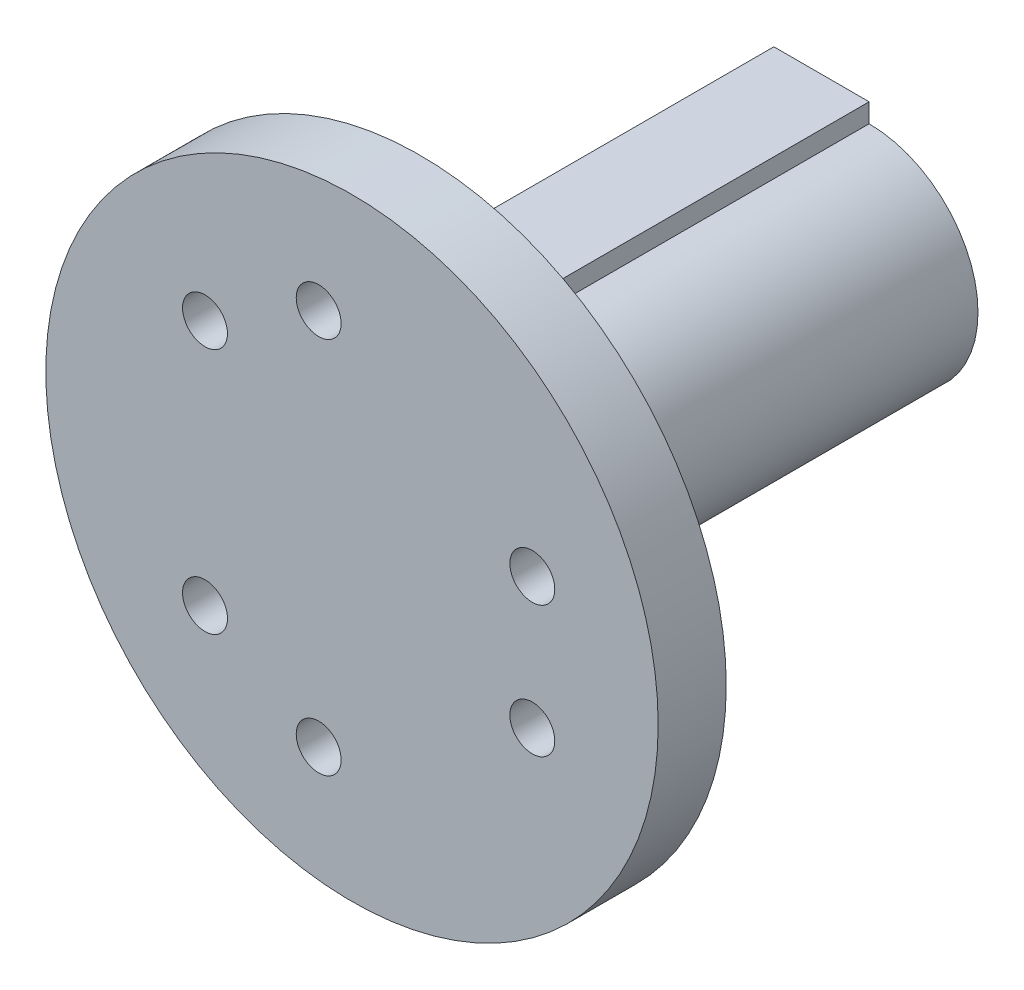
ISO-10303-21;
HEADER;
FILE_DESCRIPTION(('STEP AP214'),'2;1');
FILE_NAME('part.step','',(''),(''),'','','');
FILE_SCHEMA(('AUTOMOTIVE_DESIGN { 1 0 10303 214 1 1 1 1 }'));
ENDSEC;
DATA;
#1=APPLICATION_CONTEXT('core data for automotive mechanical design processes');
#2=APPLICATION_PROTOCOL_DEFINITION('international standard','automotive_design',2000,#1);
#3=PRODUCT_CONTEXT('',#1,'mechanical');
#4=PRODUCT('Part','Part','',(#3));
#5=PRODUCT_RELATED_PRODUCT_CATEGORY('part','',(#4));
#6=PRODUCT_DEFINITION_FORMATION('','',#4);
#7=PRODUCT_DEFINITION_CONTEXT('part definition',#1,'design');
#8=PRODUCT_DEFINITION('design','',#6,#7);
#9=PRODUCT_DEFINITION_SHAPE('','',#8);
#10=(LENGTH_UNIT() NAMED_UNIT(*) SI_UNIT(.MILLI.,.METRE.));
#11=(NAMED_UNIT(*) PLANE_ANGLE_UNIT() SI_UNIT($,.RADIAN.));
#12=(NAMED_UNIT(*) SI_UNIT($,.STERADIAN.) SOLID_ANGLE_UNIT());
#13=UNCERTAINTY_MEASURE_WITH_UNIT(LENGTH_MEASURE(1.E-05),#10,'distance_accuracy_value','');
#14=(GEOMETRIC_REPRESENTATION_CONTEXT(3) GLOBAL_UNCERTAINTY_ASSIGNED_CONTEXT((#13)) GLOBAL_UNIT_ASSIGNED_CONTEXT((#10,
#11,#12)) REPRESENTATION_CONTEXT('',''));
#15=CARTESIAN_POINT('',(0.,0.,0.));
#16=DIRECTION('',(0.,0.,1.));
#17=DIRECTION('',(1.,0.,0.));
#18=AXIS2_PLACEMENT_3D('',#15,#16,#17);
#19=CARTESIAN_POINT('',(0.,25.,-10.));
#20=DIRECTION('',(0.,0.,-1.));
#21=DIRECTION('',(-1.,0.,0.));
#22=AXIS2_PLACEMENT_3D('',#19,#20,#21);
#23=PLANE('',#22);
#24=CARTESIAN_POINT('',(0.,0.,-10.));
#25=DIRECTION('',(0.,0.,-1.));
#26=DIRECTION('',(-1.,0.,0.));
#27=AXIS2_PLACEMENT_3D('',#24,#25,#26);
#28=CIRCLE('',#27,8.);
#29=CARTESIAN_POINT('',(-7.,-3.87298334620742,-10.));
#30=VERTEX_POINT('',#29);
#31=CARTESIAN_POINT('',(-7.97746827007165,-0.600000000000003,-10.));
#32=VERTEX_POINT('',#31);
#33=EDGE_CURVE('E41',#30,#32,#28,.T.);
#34=ORIENTED_EDGE('',*,*,#33,.T.);
#35=DIRECTION('',(1.,0.,0.));
#36=VECTOR('',#35,1.);
#37=CARTESIAN_POINT('',(-8.,-0.600000000000003,-10.));
#38=LINE('',#37,#36);
#39=CARTESIAN_POINT('',(-7.,-0.600000000000003,-10.));
#40=VERTEX_POINT('',#39);
#41=EDGE_CURVE('E150',#32,#40,#38,.T.);
#42=ORIENTED_EDGE('',*,*,#41,.T.);
#43=DIRECTION('',(0.,1.,0.));
#44=VECTOR('',#43,1.);
#45=CARTESIAN_POINT('',(-7.,-9.4,-10.));
#46=LINE('',#45,#44);
#47=EDGE_CURVE('E186',#30,#40,#46,.T.);
#48=ORIENTED_EDGE('',*,*,#47,.F.);
#49=EDGE_LOOP('',(#34,#42,#48));
#50=FACE_BOUND('',#49,.T.);
#51=ADVANCED_FACE('F33',(#50),#23,.T.);
#52=CARTESIAN_POINT('',(-7.,0.599999999999997,-10.));
#53=VERTEX_POINT('',#52);
#54=CARTESIAN_POINT('',(-7.,3.87298334620742,-10.));
#55=VERTEX_POINT('',#54);
#56=EDGE_CURVE('E187',#53,#55,#46,.T.);
#57=ORIENTED_EDGE('',*,*,#56,.F.);
#58=DIRECTION('',(1.,0.,0.));
#59=VECTOR('',#58,1.);
#60=CARTESIAN_POINT('',(-8.,0.599999999999997,-10.));
#61=LINE('',#60,#59);
#62=CARTESIAN_POINT('',(-7.97746827007165,0.599999999999997,-10.));
#63=VERTEX_POINT('',#62);
#64=EDGE_CURVE('E305',#63,#53,#61,.T.);
#65=ORIENTED_EDGE('',*,*,#64,.F.);
#66=EDGE_CURVE('E42',#63,#55,#28,.T.);
#67=ORIENTED_EDGE('',*,*,#66,.T.);
#68=EDGE_LOOP('',(#57,#65,#67));
#69=FACE_BOUND('',#68,.T.);
#70=ADVANCED_FACE('F307',(#69),#23,.T.);
#71=CARTESIAN_POINT('',(-7.,0.,0.));
#72=DIRECTION('',(1.,0.,0.));
#73=DIRECTION('',(0.,0.,-1.));
#74=AXIS2_PLACEMENT_3D('',#71,#72,#73);
#75=PLANE('',#74);
#76=DIRECTION('',(0.,0.,1.));
#77=VECTOR('',#76,1.);
#78=CARTESIAN_POINT('',(-7.,-0.600000000000003,-33.));
#79=LINE('',#78,#77);
#80=CARTESIAN_POINT('',(-7.,-0.600000000000003,-33.));
#81=VERTEX_POINT('',#80);
#82=EDGE_CURVE('E312',#81,#40,#79,.T.);
#83=ORIENTED_EDGE('',*,*,#82,.F.);
#84=DIRECTION('',(0.,1.,0.));
#85=VECTOR('',#84,1.);
#86=CARTESIAN_POINT('',(-7.,-9.4,-33.));
#87=LINE('',#86,#85);
#88=CARTESIAN_POINT('',(-7.,-9.4,-33.));
#89=VERTEX_POINT('',#88);
#90=EDGE_CURVE('E165',#89,#81,#87,.T.);
#91=ORIENTED_EDGE('',*,*,#90,.F.);
#92=DIRECTION('',(0.,0.,1.));
#93=VECTOR('',#92,1.);
#94=CARTESIAN_POINT('',(-7.,-9.4,-25.));
#95=LINE('',#94,#93);
#96=CARTESIAN_POINT('',(-7.,-9.4,-10.));
#97=VERTEX_POINT('',#96);
#98=EDGE_CURVE('E178',#89,#97,#95,.T.);
#99=ORIENTED_EDGE('',*,*,#98,.T.);
#100=EDGE_CURVE('E182',#97,#30,#46,.T.);
#101=ORIENTED_EDGE('',*,*,#100,.T.);
#102=ORIENTED_EDGE('',*,*,#47,.T.);
#103=EDGE_LOOP('',(#83,#91,#99,#101,#102));
#104=FACE_BOUND('',#103,.T.);
#105=ADVANCED_FACE('F320',(#104),#75,.F.);
#106=DIRECTION('',(0.,0.,-1.));
#107=VECTOR('',#106,1.);
#108=CARTESIAN_POINT('',(-7.,0.599999999999997,-33.));
#109=LINE('',#108,#107);
#110=CARTESIAN_POINT('',(-7.,0.599999999999996,-33.));
#111=VERTEX_POINT('',#110);
#112=EDGE_CURVE('E146',#53,#111,#109,.T.);
#113=ORIENTED_EDGE('',*,*,#112,.F.);
#114=ORIENTED_EDGE('',*,*,#56,.T.);
#115=CARTESIAN_POINT('',(-7.,9.4,-10.));
#116=VERTEX_POINT('',#115);
#117=EDGE_CURVE('E180',#55,#116,#46,.T.);
#118=ORIENTED_EDGE('',*,*,#117,.T.);
#119=DIRECTION('',(0.,0.,-1.));
#120=VECTOR('',#119,1.);
#121=CARTESIAN_POINT('',(-7.,9.4,-25.));
#122=LINE('',#121,#120);
#123=CARTESIAN_POINT('',(-7.,9.4,-33.));
#124=VERTEX_POINT('',#123);
#125=EDGE_CURVE('E185',#116,#124,#122,.T.);
#126=ORIENTED_EDGE('',*,*,#125,.T.);
#127=EDGE_CURVE('E164',#111,#124,#87,.T.);
#128=ORIENTED_EDGE('',*,*,#127,.F.);
#129=EDGE_LOOP('',(#113,#114,#118,#126,#128));
#130=FACE_BOUND('',#129,.T.);
#131=ADVANCED_FACE('F325',(#130),#75,.F.);
#132=CARTESIAN_POINT('',(0.,0.,-25.));
#133=DIRECTION('',(0.,0.,1.));
#134=DIRECTION('',(1.,0.,0.));
#135=AXIS2_PLACEMENT_3D('',#132,#133,#134);
#136=CYLINDRICAL_SURFACE('',#135,8.);
#137=CARTESIAN_POINT('',(0.,0.,0.));
#138=DIRECTION('',(0.,0.,1.));
#139=DIRECTION('',(1.,0.,0.));
#140=AXIS2_PLACEMENT_3D('',#137,#138,#139);
#141=CIRCLE('',#140,8.);
#142=CARTESIAN_POINT('',(8.,0.,0.));
#143=VERTEX_POINT('',#142);
#144=EDGE_CURVE('E269',#143,#143,#141,.F.);
#145=ORIENTED_EDGE('',*,*,#144,.T.);
#146=EDGE_LOOP('',(#145));
#147=FACE_BOUND('',#146,.T.);
#148=DIRECTION('',(0.,0.,1.));
#149=VECTOR('',#148,1.);
#150=CARTESIAN_POINT('',(0.,-8.,-25.));
#151=LINE('',#150,#149);
#152=CARTESIAN_POINT('',(0.,-8.,-33.));
#153=VERTEX_POINT('',#152);
#154=CARTESIAN_POINT('',(0.,-8.,-10.));
#155=VERTEX_POINT('',#154);
#156=EDGE_CURVE('E206',#153,#155,#151,.T.);
#157=ORIENTED_EDGE('',*,*,#156,.F.);
#158=CARTESIAN_POINT('',(0.,0.,-33.));
#159=DIRECTION('',(0.,0.,-1.));
#160=DIRECTION('',(-1.,0.,0.));
#161=AXIS2_PLACEMENT_3D('',#158,#159,#160);
#162=CIRCLE('',#161,8.);
#163=CARTESIAN_POINT('',(0.,8.,-33.));
#164=VERTEX_POINT('',#163);
#165=EDGE_CURVE('E174',#164,#153,#162,.T.);
#166=ORIENTED_EDGE('',*,*,#165,.F.);
#167=DIRECTION('',(0.,0.,1.));
#168=VECTOR('',#167,1.);
#169=CARTESIAN_POINT('',(0.,8.,-25.));
#170=LINE('',#169,#168);
#171=CARTESIAN_POINT('',(0.,8.,-10.));
#172=VERTEX_POINT('',#171);
#173=EDGE_CURVE('E204',#172,#164,#170,.F.);
#174=ORIENTED_EDGE('',*,*,#173,.F.);
#175=CARTESIAN_POINT('',(0.,0.,-10.));
#176=DIRECTION('',(0.,0.,-1.));
#177=DIRECTION('',(-1.,0.,0.));
#178=AXIS2_PLACEMENT_3D('',#175,#176,#177);
#179=CIRCLE('',#178,8.);
#180=EDGE_CURVE('E202',#55,#172,#179,.T.);
#181=ORIENTED_EDGE('',*,*,#180,.F.);
#182=ORIENTED_EDGE('',*,*,#66,.F.);
#183=CARTESIAN_POINT('',(0.,0.,-10.));
#184=DIRECTION('',(0.,0.,-1.));
#185=DIRECTION('',(-1.,0.,0.));
#186=AXIS2_PLACEMENT_3D('',#183,#184,#185);
#187=CIRCLE('',#186,8.);
#188=CARTESIAN_POINT('',(-8.,0.,-10.));
#189=VERTEX_POINT('',#188);
#190=EDGE_CURVE('E152',#189,#63,#187,.T.);
#191=ORIENTED_EDGE('',*,*,#190,.F.);
#192=EDGE_CURVE('E133',#32,#189,#187,.T.);
#193=ORIENTED_EDGE('',*,*,#192,.F.);
#194=ORIENTED_EDGE('',*,*,#33,.F.);
#195=EDGE_CURVE('E11',#155,#30,#28,.T.);
#196=ORIENTED_EDGE('',*,*,#195,.F.);
#197=EDGE_LOOP('',(#157,#166,#174,#181,#182,#191,#193,#194,#196));
#198=FACE_BOUND('',#197,.T.);
#199=ADVANCED_FACE('F296',(#147,#198),#136,.T.);
#200=CARTESIAN_POINT('',(-10.8012266479776,9.06330529658017,5.));
#201=DIRECTION('',(0.,0.,-1.));
#202=DIRECTION('',(-1.,0.,0.));
#203=AXIS2_PLACEMENT_3D('',#200,#201,#202);
#204=CYLINDRICAL_SURFACE('',#203,1.65);
#205=CARTESIAN_POINT('',(-10.8012266479776,9.06330529658017,5.));
#206=DIRECTION('',(0.,0.,1.));
#207=DIRECTION('',(1.,0.,0.));
#208=AXIS2_PLACEMENT_3D('',#205,#206,#207);
#209=CIRCLE('',#208,1.65);
#210=CARTESIAN_POINT('',(-9.15122664797762,9.06330529658017,5.));
#211=VERTEX_POINT('',#210);
#212=EDGE_CURVE('E259',#211,#211,#209,.T.);
#213=ORIENTED_EDGE('',*,*,#212,.T.);
#214=EDGE_LOOP('',(#213));
#215=FACE_BOUND('',#214,.T.);
#216=CARTESIAN_POINT('',(-10.8012266479776,9.06330529658017,2.));
#217=DIRECTION('',(0.,0.,-1.));
#218=DIRECTION('',(-1.,0.,0.));
#219=AXIS2_PLACEMENT_3D('',#216,#217,#218);
#220=CIRCLE('',#219,1.65);
#221=CARTESIAN_POINT('',(-12.4512266479776,9.06330529658017,2.));
#222=VERTEX_POINT('',#221);
#223=EDGE_CURVE('E246',#222,#222,#220,.T.);
#224=ORIENTED_EDGE('',*,*,#223,.T.);
#225=EDGE_LOOP('',(#224));
#226=FACE_BOUND('',#225,.T.);
#227=ADVANCED_FACE('F365',(#215,#226),#204,.F.);
#228=CARTESIAN_POINT('',(13.2496659530816,-4.82248402089022,5.));
#229=DIRECTION('',(0.,0.,-1.));
#230=DIRECTION('',(-1.,0.,0.));
#231=AXIS2_PLACEMENT_3D('',#228,#229,#230);
#232=CYLINDRICAL_SURFACE('',#231,1.65);
#233=CARTESIAN_POINT('',(13.2496659530816,-4.82248402089022,5.));
#234=DIRECTION('',(0.,0.,1.));
#235=DIRECTION('',(1.,0.,0.));
#236=AXIS2_PLACEMENT_3D('',#233,#234,#235);
#237=CIRCLE('',#236,1.65);
#238=CARTESIAN_POINT('',(14.8996659530816,-4.82248402089022,5.));
#239=VERTEX_POINT('',#238);
#240=EDGE_CURVE('E256',#239,#239,#237,.T.);
#241=ORIENTED_EDGE('',*,*,#240,.T.);
#242=EDGE_LOOP('',(#241));
#243=FACE_BOUND('',#242,.T.);
#244=CARTESIAN_POINT('',(13.2496659530816,-4.82248402089022,2.));
#245=DIRECTION('',(0.,0.,-1.));
#246=DIRECTION('',(-1.,0.,0.));
#247=AXIS2_PLACEMENT_3D('',#244,#245,#246);
#248=CIRCLE('',#247,1.65);
#249=CARTESIAN_POINT('',(11.5996659530816,-4.82248402089022,2.));
#250=VERTEX_POINT('',#249);
#251=EDGE_CURVE('E282',#250,#250,#248,.T.);
#252=ORIENTED_EDGE('',*,*,#251,.T.);
#253=EDGE_LOOP('',(#252));
#254=FACE_BOUND('',#253,.T.);
#255=ADVANCED_FACE('F426',(#243,#254),#232,.F.);
#256=CARTESIAN_POINT('',(13.2496659530816,4.82248402089367,5.));
#257=DIRECTION('',(0.,0.,-1.));
#258=DIRECTION('',(-1.,0.,0.));
#259=AXIS2_PLACEMENT_3D('',#256,#257,#258);
#260=CYLINDRICAL_SURFACE('',#259,1.65);
#261=CARTESIAN_POINT('',(13.2496659530816,4.82248402089367,5.));
#262=DIRECTION('',(0.,0.,1.));
#263=DIRECTION('',(1.,0.,0.));
#264=AXIS2_PLACEMENT_3D('',#261,#262,#263);
#265=CIRCLE('',#264,1.65);
#266=CARTESIAN_POINT('',(14.8996659530816,4.82248402089367,5.));
#267=VERTEX_POINT('',#266);
#268=EDGE_CURVE('E253',#267,#267,#265,.T.);
#269=ORIENTED_EDGE('',*,*,#268,.T.);
#270=EDGE_LOOP('',(#269));
#271=FACE_BOUND('',#270,.T.);
#272=CARTESIAN_POINT('',(13.2496659530816,4.82248402089367,2.));
#273=DIRECTION('',(0.,0.,-1.));
#274=DIRECTION('',(-1.,0.,0.));
#275=AXIS2_PLACEMENT_3D('',#272,#273,#274);
#276=CIRCLE('',#275,1.65);
#277=CARTESIAN_POINT('',(11.5996659530816,4.82248402089367,2.));
#278=VERTEX_POINT('',#277);
#279=EDGE_CURVE('E279',#278,#278,#276,.T.);
#280=ORIENTED_EDGE('',*,*,#279,.T.);
#281=EDGE_LOOP('',(#280));
#282=FACE_BOUND('',#281,.T.);
#283=ADVANCED_FACE('F422',(#271,#282),#260,.F.);
#284=CARTESIAN_POINT('',(-10.801226647976,-9.06330529657962,5.));
#285=DIRECTION('',(0.,0.,-1.));
#286=DIRECTION('',(-1.,0.,0.));
#287=AXIS2_PLACEMENT_3D('',#284,#285,#286);
#288=CYLINDRICAL_SURFACE('',#287,1.65);
#289=CARTESIAN_POINT('',(-10.801226647976,-9.06330529657962,5.));
#290=DIRECTION('',(0.,0.,1.));
#291=DIRECTION('',(1.,0.,0.));
#292=AXIS2_PLACEMENT_3D('',#289,#290,#291);
#293=CIRCLE('',#292,1.65);
#294=CARTESIAN_POINT('',(-9.15122664797596,-9.06330529657962,5.));
#295=VERTEX_POINT('',#294);
#296=EDGE_CURVE('E250',#295,#295,#293,.T.);
#297=ORIENTED_EDGE('',*,*,#296,.T.);
#298=EDGE_LOOP('',(#297));
#299=FACE_BOUND('',#298,.T.);
#300=CARTESIAN_POINT('',(-10.801226647976,-9.06330529657962,2.));
#301=DIRECTION('',(0.,0.,-1.));
#302=DIRECTION('',(-1.,0.,0.));
#303=AXIS2_PLACEMENT_3D('',#300,#301,#302);
#304=CIRCLE('',#303,1.65);
#305=CARTESIAN_POINT('',(-12.451226647976,-9.06330529657962,2.));
#306=VERTEX_POINT('',#305);
#307=EDGE_CURVE('E276',#306,#306,#304,.T.);
#308=ORIENTED_EDGE('',*,*,#307,.T.);
#309=EDGE_LOOP('',(#308));
#310=FACE_BOUND('',#309,.T.);
#311=ADVANCED_FACE('F418',(#299,#310),#288,.F.);
#312=CARTESIAN_POINT('',(-2.44843930510205,-13.8857893174715,5.));
#313=DIRECTION('',(0.,0.,-1.));
#314=DIRECTION('',(-1.,0.,0.));
#315=AXIS2_PLACEMENT_3D('',#312,#313,#314);
#316=CYLINDRICAL_SURFACE('',#315,1.65);
#317=CARTESIAN_POINT('',(-2.44843930510205,-13.8857893174715,5.));
#318=DIRECTION('',(0.,0.,1.));
#319=DIRECTION('',(1.,0.,0.));
#320=AXIS2_PLACEMENT_3D('',#317,#318,#319);
#321=CIRCLE('',#320,1.65);
#322=CARTESIAN_POINT('',(-0.798439305102052,-13.8857893174715,5.));
#323=VERTEX_POINT('',#322);
#324=EDGE_CURVE('E247',#323,#323,#321,.T.);
#325=ORIENTED_EDGE('',*,*,#324,.T.);
#326=EDGE_LOOP('',(#325));
#327=FACE_BOUND('',#326,.T.);
#328=CARTESIAN_POINT('',(-2.44843930510205,-13.8857893174715,2.));
#329=DIRECTION('',(0.,0.,-1.));
#330=DIRECTION('',(-1.,0.,0.));
#331=AXIS2_PLACEMENT_3D('',#328,#329,#330);
#332=CIRCLE('',#331,1.65);
#333=CARTESIAN_POINT('',(-4.09843930510205,-13.8857893174715,2.));
#334=VERTEX_POINT('',#333);
#335=EDGE_CURVE('E212',#334,#334,#332,.T.);
#336=ORIENTED_EDGE('',*,*,#335,.T.);
#337=EDGE_LOOP('',(#336));
#338=FACE_BOUND('',#337,.T.);
#339=ADVANCED_FACE('F414',(#327,#338),#316,.F.);
#340=CARTESIAN_POINT('',(-2.44843930510373,13.8857893174721,5.));
#341=DIRECTION('',(0.,0.,-1.));
#342=DIRECTION('',(-1.,0.,0.));
#343=AXIS2_PLACEMENT_3D('',#340,#341,#342);
#344=CYLINDRICAL_SURFACE('',#343,1.65);
#345=CARTESIAN_POINT('',(-2.44843930510373,13.8857893174721,5.));
#346=DIRECTION('',(0.,0.,1.));
#347=DIRECTION('',(1.,0.,0.));
#348=AXIS2_PLACEMENT_3D('',#345,#346,#347);
#349=CIRCLE('',#348,1.65);
#350=CARTESIAN_POINT('',(-0.798439305103731,13.8857893174721,5.));
#351=VERTEX_POINT('',#350);
#352=EDGE_CURVE('E262',#351,#351,#349,.T.);
#353=ORIENTED_EDGE('',*,*,#352,.T.);
#354=EDGE_LOOP('',(#353));
#355=FACE_BOUND('',#354,.T.);
#356=CARTESIAN_POINT('',(-2.44843930510373,13.8857893174721,2.));
#357=DIRECTION('',(0.,0.,-1.));
#358=DIRECTION('',(-1.,0.,0.));
#359=AXIS2_PLACEMENT_3D('',#356,#357,#358);
#360=CIRCLE('',#359,1.65);
#361=CARTESIAN_POINT('',(-4.09843930510373,13.8857893174721,2.));
#362=VERTEX_POINT('',#361);
#363=EDGE_CURVE('E242',#362,#362,#360,.T.);
#364=ORIENTED_EDGE('',*,*,#363,.T.);
#365=EDGE_LOOP('',(#364));
#366=FACE_BOUND('',#365,.T.);
#367=ADVANCED_FACE('F417',(#355,#366),#344,.F.);
#368=CARTESIAN_POINT('',(0.,0.,5.));
#369=DIRECTION('',(0.,0.,1.));
#370=DIRECTION('',(1.,0.,0.));
#371=AXIS2_PLACEMENT_3D('',#368,#369,#370);
#372=PLANE('',#371);
#373=ORIENTED_EDGE('',*,*,#296,.F.);
#374=EDGE_LOOP('',(#373));
#375=FACE_BOUND('',#374,.T.);
#376=ORIENTED_EDGE('',*,*,#240,.F.);
#377=EDGE_LOOP('',(#376));
#378=FACE_BOUND('',#377,.T.);
#379=ORIENTED_EDGE('',*,*,#352,.F.);
#380=EDGE_LOOP('',(#379));
#381=FACE_BOUND('',#380,.T.);
#382=CARTESIAN_POINT('',(0.,0.,5.));
#383=DIRECTION('',(0.,0.,1.));
#384=DIRECTION('',(1.,0.,0.));
#385=AXIS2_PLACEMENT_3D('',#382,#383,#384);
#386=CIRCLE('',#385,22.5);
#387=CARTESIAN_POINT('',(22.5,0.,5.));
#388=VERTEX_POINT('',#387);
#389=EDGE_CURVE('E266',#388,#388,#386,.T.);
#390=ORIENTED_EDGE('',*,*,#389,.T.);
#391=EDGE_LOOP('',(#390));
#392=FACE_BOUND('',#391,.T.);
#393=ORIENTED_EDGE('',*,*,#212,.F.);
#394=EDGE_LOOP('',(#393));
#395=FACE_BOUND('',#394,.T.);
#396=ORIENTED_EDGE('',*,*,#268,.F.);
#397=EDGE_LOOP('',(#396));
#398=FACE_BOUND('',#397,.T.);
#399=ORIENTED_EDGE('',*,*,#324,.F.);
#400=EDGE_LOOP('',(#399));
#401=FACE_BOUND('',#400,.T.);
#402=ADVANCED_FACE('F436',(#375,#378,#381,#392,#395,#398,#401),#372,.T.);
#403=CARTESIAN_POINT('',(0.,0.,0.));
#404=DIRECTION('',(0.,0.,1.));
#405=DIRECTION('',(1.,0.,0.));
#406=AXIS2_PLACEMENT_3D('',#403,#404,#405);
#407=PLANE('',#406);
#408=ORIENTED_EDGE('',*,*,#144,.F.);
#409=EDGE_LOOP('',(#408));
#410=FACE_BOUND('',#409,.T.);
#411=CARTESIAN_POINT('',(-10.8012266479776,9.06330529658017,0.));
#412=DIRECTION('',(0.,0.,-1.));
#413=DIRECTION('',(-1.,0.,0.));
#414=AXIS2_PLACEMENT_3D('',#411,#412,#413);
#415=CIRCLE('',#414,3.);
#416=CARTESIAN_POINT('',(-13.8012266479776,9.06330529658017,0.));
#417=VERTEX_POINT('',#416);
#418=EDGE_CURVE('E213',#417,#417,#415,.T.);
#419=ORIENTED_EDGE('',*,*,#418,.F.);
#420=EDGE_LOOP('',(#419));
#421=FACE_BOUND('',#420,.T.);
#422=CARTESIAN_POINT('',(-10.801226647976,-9.06330529657962,0.));
#423=DIRECTION('',(0.,0.,-1.));
#424=DIRECTION('',(-1.,0.,0.));
#425=AXIS2_PLACEMENT_3D('',#422,#423,#424);
#426=CIRCLE('',#425,3.);
#427=CARTESIAN_POINT('',(-13.801226647976,-9.06330529657962,0.));
#428=VERTEX_POINT('',#427);
#429=EDGE_CURVE('E219',#428,#428,#426,.T.);
#430=ORIENTED_EDGE('',*,*,#429,.F.);
#431=EDGE_LOOP('',(#430));
#432=FACE_BOUND('',#431,.T.);
#433=CARTESIAN_POINT('',(-2.44843930510205,-13.8857893174715,0.));
#434=DIRECTION('',(0.,0.,-1.));
#435=DIRECTION('',(-1.,0.,0.));
#436=AXIS2_PLACEMENT_3D('',#433,#434,#435);
#437=CIRCLE('',#436,3.);
#438=CARTESIAN_POINT('',(-5.44843930510205,-13.8857893174715,0.));
#439=VERTEX_POINT('',#438);
#440=EDGE_CURVE('E225',#439,#439,#437,.T.);
#441=ORIENTED_EDGE('',*,*,#440,.F.);
#442=EDGE_LOOP('',(#441));
#443=FACE_BOUND('',#442,.T.);
#444=CARTESIAN_POINT('',(13.2496659530816,-4.82248402089022,0.));
#445=DIRECTION('',(0.,0.,-1.));
#446=DIRECTION('',(-1.,0.,0.));
#447=AXIS2_PLACEMENT_3D('',#444,#445,#446);
#448=CIRCLE('',#447,3.);
#449=CARTESIAN_POINT('',(10.2496659530816,-4.82248402089022,0.));
#450=VERTEX_POINT('',#449);
#451=EDGE_CURVE('E231',#450,#450,#448,.T.);
#452=ORIENTED_EDGE('',*,*,#451,.F.);
#453=EDGE_LOOP('',(#452));
#454=FACE_BOUND('',#453,.T.);
#455=CARTESIAN_POINT('',(13.2496659530816,4.82248402089367,0.));
#456=DIRECTION('',(0.,0.,-1.));
#457=DIRECTION('',(-1.,0.,0.));
#458=AXIS2_PLACEMENT_3D('',#455,#456,#457);
#459=CIRCLE('',#458,3.);
#460=CARTESIAN_POINT('',(10.2496659530816,4.82248402089367,0.));
#461=VERTEX_POINT('',#460);
#462=EDGE_CURVE('E208',#461,#461,#459,.T.);
#463=ORIENTED_EDGE('',*,*,#462,.F.);
#464=EDGE_LOOP('',(#463));
#465=FACE_BOUND('',#464,.T.);
#466=CARTESIAN_POINT('',(-2.44843930510373,13.8857893174721,0.));
#467=DIRECTION('',(0.,0.,-1.));
#468=DIRECTION('',(-1.,0.,0.));
#469=AXIS2_PLACEMENT_3D('',#466,#467,#468);
#470=CIRCLE('',#469,3.);
#471=CARTESIAN_POINT('',(-5.44843930510373,13.8857893174721,0.));
#472=VERTEX_POINT('',#471);
#473=EDGE_CURVE('E243',#472,#472,#470,.T.);
#474=ORIENTED_EDGE('',*,*,#473,.F.);
#475=EDGE_LOOP('',(#474));
#476=FACE_BOUND('',#475,.T.);
#477=CARTESIAN_POINT('',(0.,0.,0.));
#478=DIRECTION('',(0.,0.,1.));
#479=DIRECTION('',(1.,0.,0.));
#480=AXIS2_PLACEMENT_3D('',#477,#478,#479);
#481=CIRCLE('',#480,22.5);
#482=CARTESIAN_POINT('',(22.5,0.,0.));
#483=VERTEX_POINT('',#482);
#484=EDGE_CURVE('E265',#483,#483,#481,.T.);
#485=ORIENTED_EDGE('',*,*,#484,.F.);
#486=EDGE_LOOP('',(#485));
#487=FACE_BOUND('',#486,.T.);
#488=ADVANCED_FACE('F439',(#410,#421,#432,#443,#454,#465,#476,#487),#407,.F.);
#489=CARTESIAN_POINT('',(0.,0.,5.));
#490=DIRECTION('',(0.,0.,-1.));
#491=DIRECTION('',(-1.,0.,0.));
#492=AXIS2_PLACEMENT_3D('',#489,#490,#491);
#493=CYLINDRICAL_SURFACE('',#492,22.5);
#494=ORIENTED_EDGE('',*,*,#389,.F.);
#495=EDGE_LOOP('',(#494));
#496=FACE_BOUND('',#495,.T.);
#497=ORIENTED_EDGE('',*,*,#484,.T.);
#498=EDGE_LOOP('',(#497));
#499=FACE_BOUND('',#498,.T.);
#500=ADVANCED_FACE('F35',(#496,#499),#493,.T.);
#501=CARTESIAN_POINT('',(-2.44843930510373,13.8857893174721,2.));
#502=DIRECTION('',(0.,0.,-1.));
#503=DIRECTION('',(-1.,0.,0.));
#504=AXIS2_PLACEMENT_3D('',#501,#502,#503);
#505=CYLINDRICAL_SURFACE('',#504,3.);
#506=CARTESIAN_POINT('',(-2.44843930510373,13.8857893174721,2.));
#507=DIRECTION('',(0.,0.,-1.));
#508=DIRECTION('',(-1.,0.,0.));
#509=AXIS2_PLACEMENT_3D('',#506,#507,#508);
#510=CIRCLE('',#509,3.);
#511=CARTESIAN_POINT('',(-5.44843930510373,13.8857893174721,2.));
#512=VERTEX_POINT('',#511);
#513=EDGE_CURVE('E239',#512,#512,#510,.T.);
#514=ORIENTED_EDGE('',*,*,#513,.F.);
#515=EDGE_LOOP('',(#514));
#516=FACE_BOUND('',#515,.T.);
#517=ORIENTED_EDGE('',*,*,#473,.T.);
#518=EDGE_LOOP('',(#517));
#519=FACE_BOUND('',#518,.T.);
#520=ADVANCED_FACE('F409',(#516,#519),#505,.F.);
#521=CARTESIAN_POINT('',(-2.44843930510373,13.8857893174721,2.));
#522=DIRECTION('',(0.,0.,-1.));
#523=DIRECTION('',(-1.,0.,0.));
#524=AXIS2_PLACEMENT_3D('',#521,#522,#523);
#525=PLANE('',#524);
#526=ORIENTED_EDGE('',*,*,#363,.F.);
#527=EDGE_LOOP('',(#526));
#528=FACE_BOUND('',#527,.T.);
#529=ORIENTED_EDGE('',*,*,#513,.T.);
#530=EDGE_LOOP('',(#529));
#531=FACE_BOUND('',#530,.T.);
#532=ADVANCED_FACE('F391',(#528,#531),#525,.T.);
#533=CARTESIAN_POINT('',(-2.44843930510205,-13.8857893174715,2.));
#534=DIRECTION('',(0.,0.,-1.));
#535=DIRECTION('',(-1.,0.,0.));
#536=AXIS2_PLACEMENT_3D('',#533,#534,#535);
#537=CYLINDRICAL_SURFACE('',#536,3.);
#538=CARTESIAN_POINT('',(-2.44843930510205,-13.8857893174715,2.));
#539=DIRECTION('',(0.,0.,-1.));
#540=DIRECTION('',(-1.,0.,0.));
#541=AXIS2_PLACEMENT_3D('',#538,#539,#540);
#542=CIRCLE('',#541,3.);
#543=CARTESIAN_POINT('',(-5.44843930510205,-13.8857893174715,2.));
#544=VERTEX_POINT('',#543);
#545=EDGE_CURVE('E222',#544,#544,#542,.T.);
#546=ORIENTED_EDGE('',*,*,#545,.F.);
#547=EDGE_LOOP('',(#546));
#548=FACE_BOUND('',#547,.T.);
#549=ORIENTED_EDGE('',*,*,#440,.T.);
#550=EDGE_LOOP('',(#549));
#551=FACE_BOUND('',#550,.T.);
#552=ADVANCED_FACE('F387',(#548,#551),#537,.F.);
#553=CARTESIAN_POINT('',(-2.44843930510205,-13.8857893174715,2.));
#554=DIRECTION('',(0.,0.,-1.));
#555=DIRECTION('',(-1.,0.,0.));
#556=AXIS2_PLACEMENT_3D('',#553,#554,#555);
#557=PLANE('',#556);
#558=ORIENTED_EDGE('',*,*,#335,.F.);
#559=EDGE_LOOP('',(#558));
#560=FACE_BOUND('',#559,.T.);
#561=ORIENTED_EDGE('',*,*,#545,.T.);
#562=EDGE_LOOP('',(#561));
#563=FACE_BOUND('',#562,.T.);
#564=ADVANCED_FACE('F383',(#560,#563),#557,.T.);
#565=CARTESIAN_POINT('',(-10.801226647976,-9.06330529657962,2.));
#566=DIRECTION('',(0.,0.,-1.));
#567=DIRECTION('',(-1.,0.,0.));
#568=AXIS2_PLACEMENT_3D('',#565,#566,#567);
#569=CYLINDRICAL_SURFACE('',#568,3.);
#570=CARTESIAN_POINT('',(-10.801226647976,-9.06330529657962,2.));
#571=DIRECTION('',(0.,0.,-1.));
#572=DIRECTION('',(-1.,0.,0.));
#573=AXIS2_PLACEMENT_3D('',#570,#571,#572);
#574=CIRCLE('',#573,3.);
#575=CARTESIAN_POINT('',(-13.801226647976,-9.06330529657962,2.));
#576=VERTEX_POINT('',#575);
#577=EDGE_CURVE('E216',#576,#576,#574,.T.);
#578=ORIENTED_EDGE('',*,*,#577,.F.);
#579=EDGE_LOOP('',(#578));
#580=FACE_BOUND('',#579,.T.);
#581=ORIENTED_EDGE('',*,*,#429,.T.);
#582=EDGE_LOOP('',(#581));
#583=FACE_BOUND('',#582,.T.);
#584=ADVANCED_FACE('F379',(#580,#583),#569,.F.);
#585=CARTESIAN_POINT('',(-10.801226647976,-9.06330529657962,2.));
#586=DIRECTION('',(0.,0.,-1.));
#587=DIRECTION('',(-1.,0.,0.));
#588=AXIS2_PLACEMENT_3D('',#585,#586,#587);
#589=PLANE('',#588);
#590=ORIENTED_EDGE('',*,*,#307,.F.);
#591=EDGE_LOOP('',(#590));
#592=FACE_BOUND('',#591,.T.);
#593=ORIENTED_EDGE('',*,*,#577,.T.);
#594=EDGE_LOOP('',(#593));
#595=FACE_BOUND('',#594,.T.);
#596=ADVANCED_FACE('F375',(#592,#595),#589,.T.);
#597=CARTESIAN_POINT('',(13.2496659530816,4.82248402089367,2.));
#598=DIRECTION('',(0.,0.,-1.));
#599=DIRECTION('',(-1.,0.,0.));
#600=AXIS2_PLACEMENT_3D('',#597,#598,#599);
#601=CYLINDRICAL_SURFACE('',#600,3.);
#602=CARTESIAN_POINT('',(13.2496659530816,4.82248402089367,2.));
#603=DIRECTION('',(0.,0.,-1.));
#604=DIRECTION('',(-1.,0.,0.));
#605=AXIS2_PLACEMENT_3D('',#602,#603,#604);
#606=CIRCLE('',#605,3.);
#607=CARTESIAN_POINT('',(10.2496659530816,4.82248402089367,2.));
#608=VERTEX_POINT('',#607);
#609=EDGE_CURVE('E234',#608,#608,#606,.T.);
#610=ORIENTED_EDGE('',*,*,#609,.F.);
#611=EDGE_LOOP('',(#610));
#612=FACE_BOUND('',#611,.T.);
#613=ORIENTED_EDGE('',*,*,#462,.T.);
#614=EDGE_LOOP('',(#613));
#615=FACE_BOUND('',#614,.T.);
#616=ADVANCED_FACE('F378',(#612,#615),#601,.F.);
#617=CARTESIAN_POINT('',(13.2496659530816,4.82248402089367,2.));
#618=DIRECTION('',(0.,0.,-1.));
#619=DIRECTION('',(-1.,0.,0.));
#620=AXIS2_PLACEMENT_3D('',#617,#618,#619);
#621=PLANE('',#620);
#622=ORIENTED_EDGE('',*,*,#279,.F.);
#623=EDGE_LOOP('',(#622));
#624=FACE_BOUND('',#623,.T.);
#625=ORIENTED_EDGE('',*,*,#609,.T.);
#626=EDGE_LOOP('',(#625));
#627=FACE_BOUND('',#626,.T.);
#628=ADVANCED_FACE('F399',(#624,#627),#621,.T.);
#629=CARTESIAN_POINT('',(13.2496659530816,-4.82248402089022,2.));
#630=DIRECTION('',(0.,0.,-1.));
#631=DIRECTION('',(-1.,0.,0.));
#632=AXIS2_PLACEMENT_3D('',#629,#630,#631);
#633=CYLINDRICAL_SURFACE('',#632,3.);
#634=CARTESIAN_POINT('',(13.2496659530816,-4.82248402089022,2.));
#635=DIRECTION('',(0.,0.,-1.));
#636=DIRECTION('',(-1.,0.,0.));
#637=AXIS2_PLACEMENT_3D('',#634,#635,#636);
#638=CIRCLE('',#637,3.);
#639=CARTESIAN_POINT('',(10.2496659530816,-4.82248402089022,2.));
#640=VERTEX_POINT('',#639);
#641=EDGE_CURVE('E228',#640,#640,#638,.T.);
#642=ORIENTED_EDGE('',*,*,#641,.F.);
#643=EDGE_LOOP('',(#642));
#644=FACE_BOUND('',#643,.T.);
#645=ORIENTED_EDGE('',*,*,#451,.T.);
#646=EDGE_LOOP('',(#645));
#647=FACE_BOUND('',#646,.T.);
#648=ADVANCED_FACE('F395',(#644,#647),#633,.F.);
#649=CARTESIAN_POINT('',(13.2496659530816,-4.82248402089022,2.));
#650=DIRECTION('',(0.,0.,-1.));
#651=DIRECTION('',(-1.,0.,0.));
#652=AXIS2_PLACEMENT_3D('',#649,#650,#651);
#653=PLANE('',#652);
#654=ORIENTED_EDGE('',*,*,#251,.F.);
#655=EDGE_LOOP('',(#654));
#656=FACE_BOUND('',#655,.T.);
#657=ORIENTED_EDGE('',*,*,#641,.T.);
#658=EDGE_LOOP('',(#657));
#659=FACE_BOUND('',#658,.T.);
#660=ADVANCED_FACE('F373',(#656,#659),#653,.T.);
#661=CARTESIAN_POINT('',(-10.8012266479776,9.06330529658017,2.));
#662=DIRECTION('',(0.,0.,-1.));
#663=DIRECTION('',(-1.,0.,0.));
#664=AXIS2_PLACEMENT_3D('',#661,#662,#663);
#665=CYLINDRICAL_SURFACE('',#664,3.);
#666=CARTESIAN_POINT('',(-10.8012266479776,9.06330529658017,2.));
#667=DIRECTION('',(0.,0.,-1.));
#668=DIRECTION('',(-1.,0.,0.));
#669=AXIS2_PLACEMENT_3D('',#666,#667,#668);
#670=CIRCLE('',#669,3.);
#671=CARTESIAN_POINT('',(-13.8012266479776,9.06330529658017,2.));
#672=VERTEX_POINT('',#671);
#673=EDGE_CURVE('E209',#672,#672,#670,.T.);
#674=ORIENTED_EDGE('',*,*,#673,.F.);
#675=EDGE_LOOP('',(#674));
#676=FACE_BOUND('',#675,.T.);
#677=ORIENTED_EDGE('',*,*,#418,.T.);
#678=EDGE_LOOP('',(#677));
#679=FACE_BOUND('',#678,.T.);
#680=ADVANCED_FACE('F369',(#676,#679),#665,.F.);
#681=CARTESIAN_POINT('',(-10.8012266479776,9.06330529658017,2.));
#682=DIRECTION('',(0.,0.,-1.));
#683=DIRECTION('',(-1.,0.,0.));
#684=AXIS2_PLACEMENT_3D('',#681,#682,#683);
#685=PLANE('',#684);
#686=ORIENTED_EDGE('',*,*,#223,.F.);
#687=EDGE_LOOP('',(#686));
#688=FACE_BOUND('',#687,.T.);
#689=ORIENTED_EDGE('',*,*,#673,.T.);
#690=EDGE_LOOP('',(#689));
#691=FACE_BOUND('',#690,.T.);
#692=ADVANCED_FACE('F366',(#688,#691),#685,.T.);
#693=CARTESIAN_POINT('',(0.,0.,0.));
#694=DIRECTION('',(1.,0.,0.));
#695=DIRECTION('',(0.,0.,-1.));
#696=AXIS2_PLACEMENT_3D('',#693,#694,#695);
#697=PLANE('',#696);
#698=ORIENTED_EDGE('',*,*,#173,.T.);
#699=DIRECTION('',(0.,-1.,0.));
#700=VECTOR('',#699,1.);
#701=CARTESIAN_POINT('',(0.,8.,-33.));
#702=LINE('',#701,#700);
#703=CARTESIAN_POINT('',(0.,9.4,-33.));
#704=VERTEX_POINT('',#703);
#705=EDGE_CURVE('E171',#704,#164,#702,.T.);
#706=ORIENTED_EDGE('',*,*,#705,.F.);
#707=DIRECTION('',(0.,0.,-1.));
#708=VECTOR('',#707,1.);
#709=CARTESIAN_POINT('',(0.,9.4,-25.));
#710=LINE('',#709,#708);
#711=CARTESIAN_POINT('',(0.,9.4,-10.));
#712=VERTEX_POINT('',#711);
#713=EDGE_CURVE('E181',#712,#704,#710,.T.);
#714=ORIENTED_EDGE('',*,*,#713,.F.);
#715=DIRECTION('',(0.,1.,0.));
#716=VECTOR('',#715,1.);
#717=CARTESIAN_POINT('',(0.,-9.4,-10.));
#718=LINE('',#717,#716);
#719=EDGE_CURVE('E192',#172,#712,#718,.T.);
#720=ORIENTED_EDGE('',*,*,#719,.F.);
#721=EDGE_LOOP('',(#698,#706,#714,#720));
#722=FACE_BOUND('',#721,.T.);
#723=ADVANCED_FACE('F337',(#722),#697,.T.);
#724=ORIENTED_EDGE('',*,*,#156,.T.);
#725=CARTESIAN_POINT('',(0.,-9.4,-10.));
#726=VERTEX_POINT('',#725);
#727=EDGE_CURVE('E193',#726,#155,#718,.T.);
#728=ORIENTED_EDGE('',*,*,#727,.F.);
#729=DIRECTION('',(0.,0.,1.));
#730=VECTOR('',#729,1.);
#731=CARTESIAN_POINT('',(0.,-9.4,-25.));
#732=LINE('',#731,#730);
#733=CARTESIAN_POINT('',(0.,-9.4,-33.));
#734=VERTEX_POINT('',#733);
#735=EDGE_CURVE('E177',#734,#726,#732,.T.);
#736=ORIENTED_EDGE('',*,*,#735,.F.);
#737=DIRECTION('',(0.,-1.,0.));
#738=VECTOR('',#737,1.);
#739=CARTESIAN_POINT('',(0.,-9.4,-33.));
#740=LINE('',#739,#738);
#741=EDGE_CURVE('E158',#153,#734,#740,.T.);
#742=ORIENTED_EDGE('',*,*,#741,.F.);
#743=EDGE_LOOP('',(#724,#728,#736,#742));
#744=FACE_BOUND('',#743,.T.);
#745=ADVANCED_FACE('F341',(#744),#697,.T.);
#746=CARTESIAN_POINT('',(-7.,-9.4,-10.));
#747=DIRECTION('',(0.,0.,-1.));
#748=DIRECTION('',(-1.,0.,0.));
#749=AXIS2_PLACEMENT_3D('',#746,#747,#748);
#750=PLANE('',#749);
#751=ORIENTED_EDGE('',*,*,#117,.F.);
#752=ORIENTED_EDGE('',*,*,#180,.T.);
#753=ORIENTED_EDGE('',*,*,#719,.T.);
#754=DIRECTION('',(1.,0.,0.));
#755=VECTOR('',#754,1.);
#756=CARTESIAN_POINT('',(-7.,9.4,-10.));
#757=LINE('',#756,#755);
#758=EDGE_CURVE('E190',#116,#712,#757,.T.);
#759=ORIENTED_EDGE('',*,*,#758,.F.);
#760=EDGE_LOOP('',(#751,#752,#753,#759));
#761=FACE_BOUND('',#760,.T.);
#762=ADVANCED_FACE('F329',(#761),#750,.F.);
#763=ORIENTED_EDGE('',*,*,#727,.T.);
#764=ORIENTED_EDGE('',*,*,#195,.T.);
#765=ORIENTED_EDGE('',*,*,#100,.F.);
#766=DIRECTION('',(1.,0.,0.));
#767=VECTOR('',#766,1.);
#768=CARTESIAN_POINT('',(-7.,-9.4,-10.));
#769=LINE('',#768,#767);
#770=EDGE_CURVE('E199',#97,#726,#769,.T.);
#771=ORIENTED_EDGE('',*,*,#770,.T.);
#772=EDGE_LOOP('',(#763,#764,#765,#771));
#773=FACE_BOUND('',#772,.T.);
#774=ADVANCED_FACE('F348',(#773),#750,.F.);
#775=CARTESIAN_POINT('',(-7.,-9.4,-25.));
#776=DIRECTION('',(0.,1.,0.));
#777=DIRECTION('',(0.,0.,1.));
#778=AXIS2_PLACEMENT_3D('',#775,#776,#777);
#779=PLANE('',#778);
#780=ORIENTED_EDGE('',*,*,#735,.T.);
#781=ORIENTED_EDGE('',*,*,#770,.F.);
#782=ORIENTED_EDGE('',*,*,#98,.F.);
#783=DIRECTION('',(-1.,0.,0.));
#784=VECTOR('',#783,1.);
#785=CARTESIAN_POINT('',(0.,-9.4,-33.));
#786=LINE('',#785,#784);
#787=EDGE_CURVE('E161',#734,#89,#786,.T.);
#788=ORIENTED_EDGE('',*,*,#787,.F.);
#789=EDGE_LOOP('',(#780,#781,#782,#788));
#790=FACE_BOUND('',#789,.T.);
#791=ADVANCED_FACE('F346',(#790),#779,.F.);
#792=CARTESIAN_POINT('',(-7.,9.4,-25.));
#793=DIRECTION('',(0.,-1.,0.));
#794=DIRECTION('',(0.,0.,-1.));
#795=AXIS2_PLACEMENT_3D('',#792,#793,#794);
#796=PLANE('',#795);
#797=ORIENTED_EDGE('',*,*,#713,.T.);
#798=DIRECTION('',(1.,0.,0.));
#799=VECTOR('',#798,1.);
#800=CARTESIAN_POINT('',(0.,9.4,-33.));
#801=LINE('',#800,#799);
#802=EDGE_CURVE('E168',#124,#704,#801,.T.);
#803=ORIENTED_EDGE('',*,*,#802,.F.);
#804=ORIENTED_EDGE('',*,*,#125,.F.);
#805=ORIENTED_EDGE('',*,*,#758,.T.);
#806=EDGE_LOOP('',(#797,#803,#804,#805));
#807=FACE_BOUND('',#806,.T.);
#808=ADVANCED_FACE('F333',(#807),#796,.F.);
#809=CARTESIAN_POINT('',(0.,0.,-33.));
#810=DIRECTION('',(0.,0.,-1.));
#811=DIRECTION('',(-1.,0.,0.));
#812=AXIS2_PLACEMENT_3D('',#809,#810,#811);
#813=PLANE('',#812);
#814=ORIENTED_EDGE('',*,*,#741,.T.);
#815=ORIENTED_EDGE('',*,*,#787,.T.);
#816=ORIENTED_EDGE('',*,*,#90,.T.);
#817=DIRECTION('',(1.,0.,0.));
#818=VECTOR('',#817,1.);
#819=CARTESIAN_POINT('',(-8.,-0.600000000000003,-33.));
#820=LINE('',#819,#818);
#821=CARTESIAN_POINT('',(-8.,-0.600000000000003,-33.));
#822=VERTEX_POINT('',#821);
#823=EDGE_CURVE('E308',#822,#81,#820,.T.);
#824=ORIENTED_EDGE('',*,*,#823,.F.);
#825=DIRECTION('',(0.,-1.,0.));
#826=VECTOR('',#825,1.);
#827=CARTESIAN_POINT('',(-8.,-0.600000000000003,-33.));
#828=LINE('',#827,#826);
#829=CARTESIAN_POINT('',(-8.,0.599999999999997,-33.));
#830=VERTEX_POINT('',#829);
#831=EDGE_CURVE('E143',#830,#822,#828,.T.);
#832=ORIENTED_EDGE('',*,*,#831,.F.);
#833=DIRECTION('',(1.,0.,0.));
#834=VECTOR('',#833,1.);
#835=CARTESIAN_POINT('',(-8.,0.599999999999997,-33.));
#836=LINE('',#835,#834);
#837=EDGE_CURVE('E49',#830,#111,#836,.T.);
#838=ORIENTED_EDGE('',*,*,#837,.T.);
#839=ORIENTED_EDGE('',*,*,#127,.T.);
#840=ORIENTED_EDGE('',*,*,#802,.T.);
#841=ORIENTED_EDGE('',*,*,#705,.T.);
#842=ORIENTED_EDGE('',*,*,#165,.T.);
#843=EDGE_LOOP('',(#814,#815,#816,#824,#832,#838,#839,#840,#841,#842));
#844=FACE_BOUND('',#843,.T.);
#845=ADVANCED_FACE('F316',(#844),#813,.T.);
#846=CARTESIAN_POINT('',(-8.,-0.600000000000003,-10.));
#847=DIRECTION('',(0.,0.,-1.));
#848=DIRECTION('',(-1.,0.,0.));
#849=AXIS2_PLACEMENT_3D('',#846,#847,#848);
#850=PLANE('',#849);
#851=DIRECTION('',(0.,1.,0.));
#852=VECTOR('',#851,1.);
#853=CARTESIAN_POINT('',(-8.,-0.600000000000003,-10.));
#854=LINE('',#853,#852);
#855=CARTESIAN_POINT('',(-8.,0.599999999999997,-10.));
#856=VERTEX_POINT('',#855);
#857=EDGE_CURVE('E138',#189,#856,#854,.T.);
#858=ORIENTED_EDGE('',*,*,#857,.F.);
#859=ORIENTED_EDGE('',*,*,#190,.T.);
#860=EDGE_CURVE('E154',#856,#63,#61,.T.);
#861=ORIENTED_EDGE('',*,*,#860,.F.);
#862=EDGE_LOOP('',(#858,#859,#861));
#863=FACE_BOUND('',#862,.T.);
#864=ADVANCED_FACE('F301',(#863),#850,.F.);
#865=CARTESIAN_POINT('',(-8.,-0.600000000000003,-10.));
#866=VERTEX_POINT('',#865);
#867=EDGE_CURVE('E131',#866,#32,#38,.T.);
#868=ORIENTED_EDGE('',*,*,#867,.T.);
#869=ORIENTED_EDGE('',*,*,#192,.T.);
#870=EDGE_CURVE('E127',#866,#189,#854,.T.);
#871=ORIENTED_EDGE('',*,*,#870,.F.);
#872=EDGE_LOOP('',(#868,#869,#871));
#873=FACE_BOUND('',#872,.T.);
#874=ADVANCED_FACE('F129',(#873),#850,.F.);
#875=CARTESIAN_POINT('',(-8.,-0.600000000000003,-33.));
#876=DIRECTION('',(0.,1.,0.));
#877=DIRECTION('',(0.,0.,1.));
#878=AXIS2_PLACEMENT_3D('',#875,#876,#877);
#879=PLANE('',#878);
#880=ORIENTED_EDGE('',*,*,#82,.T.);
#881=ORIENTED_EDGE('',*,*,#41,.F.);
#882=ORIENTED_EDGE('',*,*,#867,.F.);
#883=DIRECTION('',(0.,0.,1.));
#884=VECTOR('',#883,1.);
#885=CARTESIAN_POINT('',(-8.,-0.600000000000003,-33.));
#886=LINE('',#885,#884);
#887=EDGE_CURVE('E141',#822,#866,#886,.T.);
#888=ORIENTED_EDGE('',*,*,#887,.F.);
#889=ORIENTED_EDGE('',*,*,#823,.T.);
#890=EDGE_LOOP('',(#880,#881,#882,#888,#889));
#891=FACE_BOUND('',#890,.T.);
#892=ADVANCED_FACE('F148',(#891),#879,.F.);
#893=CARTESIAN_POINT('',(-8.,0.599999999999997,-33.));
#894=DIRECTION('',(0.,-1.,0.));
#895=DIRECTION('',(0.,0.,-1.));
#896=AXIS2_PLACEMENT_3D('',#893,#894,#895);
#897=PLANE('',#896);
#898=ORIENTED_EDGE('',*,*,#112,.T.);
#899=ORIENTED_EDGE('',*,*,#837,.F.);
#900=DIRECTION('',(0.,0.,-1.));
#901=VECTOR('',#900,1.);
#902=CARTESIAN_POINT('',(-8.,0.599999999999997,-33.));
#903=LINE('',#902,#901);
#904=EDGE_CURVE('E137',#856,#830,#903,.T.);
#905=ORIENTED_EDGE('',*,*,#904,.F.);
#906=ORIENTED_EDGE('',*,*,#860,.T.);
#907=ORIENTED_EDGE('',*,*,#64,.T.);
#908=EDGE_LOOP('',(#898,#899,#905,#906,#907));
#909=FACE_BOUND('',#908,.T.);
#910=ADVANCED_FACE('F304',(#909),#897,.F.);
#911=CARTESIAN_POINT('',(-8.,0.,0.));
#912=DIRECTION('',(-1.,0.,0.));
#913=DIRECTION('',(0.,0.,1.));
#914=AXIS2_PLACEMENT_3D('',#911,#912,#913);
#915=PLANE('',#914);
#916=ORIENTED_EDGE('',*,*,#887,.T.);
#917=ORIENTED_EDGE('',*,*,#870,.T.);
#918=ORIENTED_EDGE('',*,*,#857,.T.);
#919=ORIENTED_EDGE('',*,*,#904,.T.);
#920=ORIENTED_EDGE('',*,*,#831,.T.);
#921=EDGE_LOOP('',(#916,#917,#918,#919,#920));
#922=FACE_BOUND('',#921,.T.);
#923=ADVANCED_FACE('F142',(#922),#915,.T.);
#924=CLOSED_SHELL('',(#51,#70,#105,#131,#199,#227,#255,#283,#311,#339,#367,#402,#488,#500,#520,
#532,#552,#564,#584,#596,#616,#628,#648,#660,#680,#692,#723,#745,#762,#774,#791,#808,#845,#864,
#874,#892,#910,#923));
#925=MANIFOLD_SOLID_BREP('B2',#924);
#926=ADVANCED_BREP_SHAPE_REPRESENTATION('',(#18,#925),#14);
#927=SHAPE_DEFINITION_REPRESENTATION(#9,#926);
ENDSEC;
END-ISO-10303-21;
